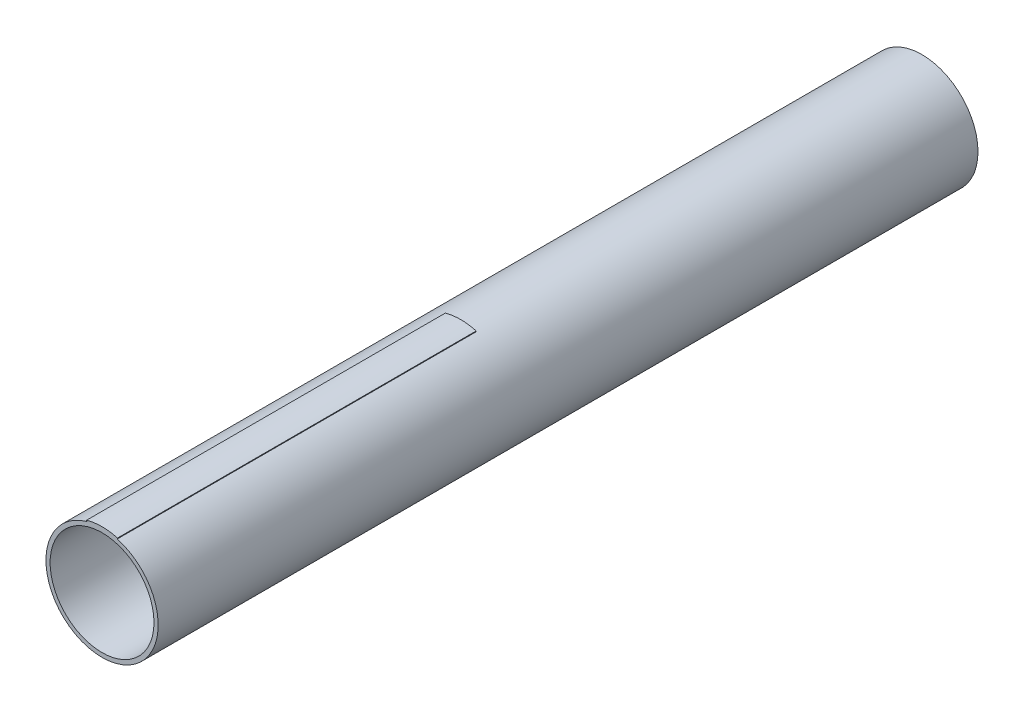
ISO-10303-21;
HEADER;
FILE_DESCRIPTION(('STEP AP214'),'2;1');
FILE_NAME('part.step','',(''),(''),'','','');
FILE_SCHEMA(('AUTOMOTIVE_DESIGN { 1 0 10303 214 1 1 1 1 }'));
ENDSEC;
DATA;
#1=APPLICATION_CONTEXT('core data for automotive mechanical design processes');
#2=APPLICATION_PROTOCOL_DEFINITION('international standard','automotive_design',2000,#1);
#3=PRODUCT_CONTEXT('',#1,'mechanical');
#4=PRODUCT('Part','Part','',(#3));
#5=PRODUCT_RELATED_PRODUCT_CATEGORY('part','',(#4));
#6=PRODUCT_DEFINITION_FORMATION('','',#4);
#7=PRODUCT_DEFINITION_CONTEXT('part definition',#1,'design');
#8=PRODUCT_DEFINITION('design','',#6,#7);
#9=PRODUCT_DEFINITION_SHAPE('','',#8);
#10=(LENGTH_UNIT() NAMED_UNIT(*) SI_UNIT(.MILLI.,.METRE.));
#11=(NAMED_UNIT(*) PLANE_ANGLE_UNIT() SI_UNIT($,.RADIAN.));
#12=(NAMED_UNIT(*) SI_UNIT($,.STERADIAN.) SOLID_ANGLE_UNIT());
#13=UNCERTAINTY_MEASURE_WITH_UNIT(LENGTH_MEASURE(1.E-05),#10,'distance_accuracy_value','');
#14=(GEOMETRIC_REPRESENTATION_CONTEXT(3) GLOBAL_UNCERTAINTY_ASSIGNED_CONTEXT((#13)) GLOBAL_UNIT_ASSIGNED_CONTEXT((#10,
#11,#12)) REPRESENTATION_CONTEXT('',''));
#15=CARTESIAN_POINT('',(0.,0.,0.));
#16=DIRECTION('',(0.,0.,1.));
#17=DIRECTION('',(1.,0.,0.));
#18=AXIS2_PLACEMENT_3D('',#15,#16,#17);
#19=CARTESIAN_POINT('',(0.,0.,800.));
#20=DIRECTION('',(0.,0.,1.));
#21=DIRECTION('',(1.,0.,0.));
#22=AXIS2_PLACEMENT_3D('',#19,#20,#21);
#23=PLANE('',#22);
#24=CARTESIAN_POINT('',(0.,0.,800.));
#25=DIRECTION('',(0.,0.,1.));
#26=DIRECTION('',(1.,0.,0.));
#27=AXIS2_PLACEMENT_3D('',#24,#25,#26);
#28=CIRCLE('',#27,109.5375);
#29=CARTESIAN_POINT('',(-29.6263560915058,105.454933175216,800.));
#30=VERTEX_POINT('',#29);
#31=CARTESIAN_POINT('',(29.6263560915059,105.454933175216,800.));
#32=VERTEX_POINT('',#31);
#33=EDGE_CURVE('E13',#30,#32,#28,.T.);
#34=ORIENTED_EDGE('',*,*,#33,.T.);
#35=DIRECTION('',(-0.270467703676877,-0.962729048729577,0.));
#36=VECTOR('',#35,1.);
#37=CARTESIAN_POINT('',(29.6263560915059,105.454933175216,800.));
#38=LINE('',#37,#36);
#39=CARTESIAN_POINT('',(30.1672914988597,107.380391272675,800.));
#40=VERTEX_POINT('',#39);
#41=EDGE_CURVE('E78',#40,#32,#38,.T.);
#42=ORIENTED_EDGE('',*,*,#41,.F.);
#43=CARTESIAN_POINT('',(0.,0.,800.));
#44=DIRECTION('',(0.,0.,-1.));
#45=DIRECTION('',(-1.,0.,0.));
#46=AXIS2_PLACEMENT_3D('',#43,#44,#45);
#47=CIRCLE('',#46,111.5375);
#48=CARTESIAN_POINT('',(-30.1672914988596,107.380391272675,800.));
#49=VERTEX_POINT('',#48);
#50=EDGE_CURVE('E138',#40,#49,#47,.F.);
#51=ORIENTED_EDGE('',*,*,#50,.T.);
#52=DIRECTION('',(0.270467703676876,-0.962729048729578,0.));
#53=VECTOR('',#52,1.);
#54=CARTESIAN_POINT('',(-29.6263560915058,105.454933175216,800.));
#55=LINE('',#54,#53);
#56=EDGE_CURVE('E114',#49,#30,#55,.T.);
#57=ORIENTED_EDGE('',*,*,#56,.T.);
#58=EDGE_LOOP('',(#34,#42,#51,#57));
#59=FACE_BOUND('',#58,.T.);
#60=CARTESIAN_POINT('',(0.,0.,800.));
#61=DIRECTION('',(0.,0.,1.));
#62=DIRECTION('',(1.,0.,0.));
#63=AXIS2_PLACEMENT_3D('',#60,#61,#62);
#64=CIRCLE('',#63,101.3587);
#65=CARTESIAN_POINT('',(101.3587,0.,800.));
#66=VERTEX_POINT('',#65);
#67=EDGE_CURVE('E71',#66,#66,#64,.T.);
#68=ORIENTED_EDGE('',*,*,#67,.F.);
#69=EDGE_LOOP('',(#68));
#70=FACE_BOUND('',#69,.T.);
#71=ADVANCED_FACE('F63',(#59,#70),#23,.T.);
#72=CARTESIAN_POINT('',(0.,0.,800.));
#73=DIRECTION('',(0.,0.,-1.));
#74=DIRECTION('',(-1.,0.,0.));
#75=AXIS2_PLACEMENT_3D('',#72,#73,#74);
#76=CYLINDRICAL_SURFACE('',#75,109.5375);
#77=ORIENTED_EDGE('',*,*,#33,.F.);
#78=DIRECTION('',(0.,0.,1.));
#79=VECTOR('',#78,1.);
#80=CARTESIAN_POINT('',(-29.6263560915058,105.454933175216,100.));
#81=LINE('',#80,#79);
#82=CARTESIAN_POINT('',(-29.6263560915058,105.454933175216,100.));
#83=VERTEX_POINT('',#82);
#84=EDGE_CURVE('E109',#83,#30,#81,.T.);
#85=ORIENTED_EDGE('',*,*,#84,.F.);
#86=CARTESIAN_POINT('',(0.,0.,100.));
#87=DIRECTION('',(0.,0.,-1.));
#88=DIRECTION('',(0.270467703676877,0.962729048729577,0.));
#89=AXIS2_PLACEMENT_3D('',#86,#87,#88);
#90=CIRCLE('',#89,109.5375);
#91=CARTESIAN_POINT('',(29.6263560915059,105.454933175216,100.));
#92=VERTEX_POINT('',#91);
#93=EDGE_CURVE('E117',#83,#92,#90,.T.);
#94=ORIENTED_EDGE('',*,*,#93,.T.);
#95=DIRECTION('',(0.,0.,-1.));
#96=VECTOR('',#95,1.);
#97=CARTESIAN_POINT('',(29.6263560915059,105.454933175216,800.));
#98=LINE('',#97,#96);
#99=EDGE_CURVE('E121',#32,#92,#98,.T.);
#100=ORIENTED_EDGE('',*,*,#99,.F.);
#101=EDGE_LOOP('',(#77,#85,#94,#100));
#102=FACE_BOUND('',#101,.T.);
#103=CARTESIAN_POINT('',(0.,0.,-800.));
#104=DIRECTION('',(0.,0.,1.));
#105=DIRECTION('',(1.,0.,0.));
#106=AXIS2_PLACEMENT_3D('',#103,#104,#105);
#107=CIRCLE('',#106,109.5375);
#108=CARTESIAN_POINT('',(109.5375,0.,-800.));
#109=VERTEX_POINT('',#108);
#110=EDGE_CURVE('E149',#109,#109,#107,.T.);
#111=ORIENTED_EDGE('',*,*,#110,.T.);
#112=EDGE_LOOP('',(#111));
#113=FACE_BOUND('',#112,.T.);
#114=ADVANCED_FACE('F65',(#102,#113),#76,.T.);
#115=CARTESIAN_POINT('',(0.,0.,800.));
#116=DIRECTION('',(0.,0.,-1.));
#117=DIRECTION('',(-1.,0.,0.));
#118=AXIS2_PLACEMENT_3D('',#115,#116,#117);
#119=CYLINDRICAL_SURFACE('',#118,101.3587);
#120=ORIENTED_EDGE('',*,*,#67,.T.);
#121=EDGE_LOOP('',(#120));
#122=FACE_BOUND('',#121,.T.);
#123=CARTESIAN_POINT('',(0.,0.,-800.));
#124=DIRECTION('',(0.,0.,1.));
#125=DIRECTION('',(1.,0.,0.));
#126=AXIS2_PLACEMENT_3D('',#123,#124,#125);
#127=CIRCLE('',#126,101.3587);
#128=CARTESIAN_POINT('',(101.3587,0.,-800.));
#129=VERTEX_POINT('',#128);
#130=EDGE_CURVE('E145',#129,#129,#127,.T.);
#131=ORIENTED_EDGE('',*,*,#130,.F.);
#132=EDGE_LOOP('',(#131));
#133=FACE_BOUND('',#132,.T.);
#134=ADVANCED_FACE('F154',(#122,#133),#119,.F.);
#135=CARTESIAN_POINT('',(0.,0.,-800.));
#136=DIRECTION('',(0.,0.,1.));
#137=DIRECTION('',(1.,0.,0.));
#138=AXIS2_PLACEMENT_3D('',#135,#136,#137);
#139=PLANE('',#138);
#140=ORIENTED_EDGE('',*,*,#130,.T.);
#141=EDGE_LOOP('',(#140));
#142=FACE_BOUND('',#141,.T.);
#143=ORIENTED_EDGE('',*,*,#110,.F.);
#144=EDGE_LOOP('',(#143));
#145=FACE_BOUND('',#144,.T.);
#146=ADVANCED_FACE('F165',(#142,#145),#139,.F.);
#147=CARTESIAN_POINT('',(-29.6263560915058,105.454933175216,450.));
#148=DIRECTION('',(-0.962729048729578,-0.270467703676876,0.));
#149=DIRECTION('',(0.,0.,1.));
#150=AXIS2_PLACEMENT_3D('',#147,#148,#149);
#151=PLANE('',#150);
#152=ORIENTED_EDGE('',*,*,#56,.F.);
#153=DIRECTION('',(0.,0.,-1.));
#154=VECTOR('',#153,1.);
#155=CARTESIAN_POINT('',(-30.1672914988596,107.380391272675,800.));
#156=LINE('',#155,#154);
#157=CARTESIAN_POINT('',(-30.1672914988596,107.380391272675,100.));
#158=VERTEX_POINT('',#157);
#159=EDGE_CURVE('E112',#158,#49,#156,.F.);
#160=ORIENTED_EDGE('',*,*,#159,.F.);
#161=DIRECTION('',(0.270467703676876,-0.962729048729578,0.));
#162=VECTOR('',#161,1.);
#163=CARTESIAN_POINT('',(-29.6263560915058,105.454933175216,100.));
#164=LINE('',#163,#162);
#165=EDGE_CURVE('E106',#158,#83,#164,.T.);
#166=ORIENTED_EDGE('',*,*,#165,.T.);
#167=ORIENTED_EDGE('',*,*,#84,.T.);
#168=EDGE_LOOP('',(#152,#160,#166,#167));
#169=FACE_BOUND('',#168,.T.);
#170=ADVANCED_FACE('F107',(#169),#151,.T.);
#171=CARTESIAN_POINT('',(0.,0.,100.));
#172=DIRECTION('',(0.,0.,1.));
#173=DIRECTION('',(1.,0.,0.));
#174=AXIS2_PLACEMENT_3D('',#171,#172,#173);
#175=PLANE('',#174);
#176=ORIENTED_EDGE('',*,*,#165,.F.);
#177=CARTESIAN_POINT('',(0.,0.,100.));
#178=DIRECTION('',(0.,0.,-1.));
#179=DIRECTION('',(-1.,0.,0.));
#180=AXIS2_PLACEMENT_3D('',#177,#178,#179);
#181=CIRCLE('',#180,111.5375);
#182=CARTESIAN_POINT('',(30.1672914988597,107.380391272675,100.));
#183=VERTEX_POINT('',#182);
#184=EDGE_CURVE('E132',#158,#183,#181,.T.);
#185=ORIENTED_EDGE('',*,*,#184,.T.);
#186=DIRECTION('',(-0.270467703676877,-0.962729048729577,0.));
#187=VECTOR('',#186,1.);
#188=CARTESIAN_POINT('',(29.6263560915059,105.454933175216,100.));
#189=LINE('',#188,#187);
#190=EDGE_CURVE('E87',#183,#92,#189,.T.);
#191=ORIENTED_EDGE('',*,*,#190,.T.);
#192=ORIENTED_EDGE('',*,*,#93,.F.);
#193=EDGE_LOOP('',(#176,#185,#191,#192));
#194=FACE_BOUND('',#193,.T.);
#195=ADVANCED_FACE('F118',(#194),#175,.F.);
#196=CARTESIAN_POINT('',(29.6263560915059,105.454933175216,450.));
#197=DIRECTION('',(0.962729048729577,-0.270467703676877,0.));
#198=DIRECTION('',(0.,0.,-1.));
#199=AXIS2_PLACEMENT_3D('',#196,#197,#198);
#200=PLANE('',#199);
#201=DIRECTION('',(0.,0.,-1.));
#202=VECTOR('',#201,1.);
#203=CARTESIAN_POINT('',(30.1672914988597,107.380391272675,800.));
#204=LINE('',#203,#202);
#205=EDGE_CURVE('E135',#40,#183,#204,.T.);
#206=ORIENTED_EDGE('',*,*,#205,.F.);
#207=ORIENTED_EDGE('',*,*,#41,.T.);
#208=ORIENTED_EDGE('',*,*,#99,.T.);
#209=ORIENTED_EDGE('',*,*,#190,.F.);
#210=EDGE_LOOP('',(#206,#207,#208,#209));
#211=FACE_BOUND('',#210,.T.);
#212=ADVANCED_FACE('F169',(#211),#200,.T.);
#213=CARTESIAN_POINT('',(0.,0.,800.));
#214=DIRECTION('',(0.,0.,-1.));
#215=DIRECTION('',(-1.,0.,0.));
#216=AXIS2_PLACEMENT_3D('',#213,#214,#215);
#217=CYLINDRICAL_SURFACE('',#216,111.5375);
#218=ORIENTED_EDGE('',*,*,#184,.F.);
#219=ORIENTED_EDGE('',*,*,#159,.T.);
#220=ORIENTED_EDGE('',*,*,#50,.F.);
#221=ORIENTED_EDGE('',*,*,#205,.T.);
#222=EDGE_LOOP('',(#218,#219,#220,#221));
#223=FACE_BOUND('',#222,.T.);
#224=ADVANCED_FACE('F172',(#223),#217,.T.);
#225=CLOSED_SHELL('',(#71,#114,#134,#146,#170,#195,#212,#224));
#226=MANIFOLD_SOLID_BREP('B2',#225);
#227=ADVANCED_BREP_SHAPE_REPRESENTATION('',(#18,#226),#14);
#228=SHAPE_DEFINITION_REPRESENTATION(#9,#227);
ENDSEC;
END-ISO-10303-21;
